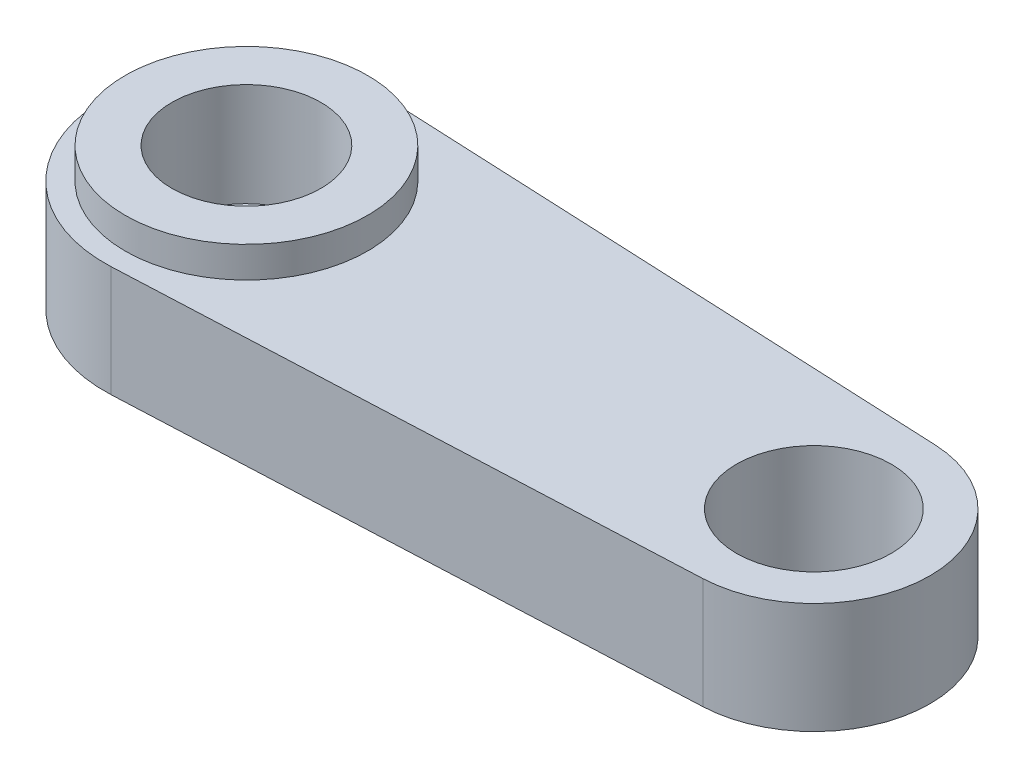
ISO-10303-21;
HEADER;
FILE_DESCRIPTION(('STEP AP214'),'2;1');
FILE_NAME('part.step','',(''),(''),'','','');
FILE_SCHEMA(('AUTOMOTIVE_DESIGN { 1 0 10303 214 1 1 1 1 }'));
ENDSEC;
DATA;
#1=APPLICATION_CONTEXT('core data for automotive mechanical design processes');
#2=APPLICATION_PROTOCOL_DEFINITION('international standard','automotive_design',2000,#1);
#3=PRODUCT_CONTEXT('',#1,'mechanical');
#4=PRODUCT('Part','Part','',(#3));
#5=PRODUCT_RELATED_PRODUCT_CATEGORY('part','',(#4));
#6=PRODUCT_DEFINITION_FORMATION('','',#4);
#7=PRODUCT_DEFINITION_CONTEXT('part definition',#1,'design');
#8=PRODUCT_DEFINITION('design','',#6,#7);
#9=PRODUCT_DEFINITION_SHAPE('','',#8);
#10=(LENGTH_UNIT() NAMED_UNIT(*) SI_UNIT(.MILLI.,.METRE.));
#11=(NAMED_UNIT(*) PLANE_ANGLE_UNIT() SI_UNIT($,.RADIAN.));
#12=(NAMED_UNIT(*) SI_UNIT($,.STERADIAN.) SOLID_ANGLE_UNIT());
#13=UNCERTAINTY_MEASURE_WITH_UNIT(LENGTH_MEASURE(1.E-05),#10,'distance_accuracy_value','');
#14=(GEOMETRIC_REPRESENTATION_CONTEXT(3) GLOBAL_UNCERTAINTY_ASSIGNED_CONTEXT((#13)) GLOBAL_UNIT_ASSIGNED_CONTEXT((#10,
#11,#12)) REPRESENTATION_CONTEXT('',''));
#15=CARTESIAN_POINT('',(0.,0.,0.));
#16=DIRECTION('',(0.,0.,1.));
#17=DIRECTION('',(1.,0.,0.));
#18=AXIS2_PLACEMENT_3D('',#15,#16,#17);
#19=CARTESIAN_POINT('',(0.,3.5,0.));
#20=DIRECTION('',(0.,-1.,0.));
#21=DIRECTION('',(0.,0.,-1.));
#22=AXIS2_PLACEMENT_3D('',#19,#20,#21);
#23=CYLINDRICAL_SURFACE('',#22,1.5);
#24=CARTESIAN_POINT('',(0.,2.5,0.));
#25=DIRECTION('',(0.,1.,0.));
#26=DIRECTION('',(0.,0.,1.));
#27=AXIS2_PLACEMENT_3D('',#24,#25,#26);
#28=CIRCLE('',#27,1.5);
#29=CARTESIAN_POINT('',(0.,2.5,1.5));
#30=VERTEX_POINT('',#29);
#31=EDGE_CURVE('E133',#30,#30,#28,.T.);
#32=ORIENTED_EDGE('',*,*,#31,.T.);
#33=EDGE_LOOP('',(#32));
#34=FACE_BOUND('',#33,.T.);
#35=CARTESIAN_POINT('',(0.,1.,0.));
#36=DIRECTION('',(0.,-1.,0.));
#37=DIRECTION('',(0.,0.,-1.));
#38=AXIS2_PLACEMENT_3D('',#35,#36,#37);
#39=CIRCLE('',#38,1.5);
#40=CARTESIAN_POINT('',(0.,1.,-1.5));
#41=VERTEX_POINT('',#40);
#42=EDGE_CURVE('E202',#41,#41,#39,.T.);
#43=ORIENTED_EDGE('',*,*,#42,.T.);
#44=EDGE_LOOP('',(#43));
#45=FACE_BOUND('',#44,.T.);
#46=ADVANCED_FACE('F71',(#34,#45),#23,.F.);
#47=CARTESIAN_POINT('',(22.,3.5,0.));
#48=DIRECTION('',(0.,-1.,0.));
#49=DIRECTION('',(0.,0.,-1.));
#50=AXIS2_PLACEMENT_3D('',#47,#48,#49);
#51=CYLINDRICAL_SURFACE('',#50,4.5);
#52=DIRECTION('',(0.,-1.,0.));
#53=VECTOR('',#52,1.);
#54=CARTESIAN_POINT('',(22.2045454545455,3.5,4.49534883596644));
#55=LINE('',#54,#53);
#56=CARTESIAN_POINT('',(22.2045454545455,5.3,4.49534883596644));
#57=VERTEX_POINT('',#56);
#58=CARTESIAN_POINT('',(22.2045454545455,1.,4.49534883596644));
#59=VERTEX_POINT('',#58);
#60=EDGE_CURVE('E128',#57,#59,#55,.T.);
#61=ORIENTED_EDGE('',*,*,#60,.T.);
#62=CARTESIAN_POINT('',(22.,1.,0.));
#63=DIRECTION('',(0.,-1.,0.));
#64=DIRECTION('',(0.,0.,-1.));
#65=AXIS2_PLACEMENT_3D('',#62,#63,#64);
#66=CIRCLE('',#65,4.5);
#67=CARTESIAN_POINT('',(22.2045454545455,1.,-4.49534883596644));
#68=VERTEX_POINT('',#67);
#69=EDGE_CURVE('E88',#68,#59,#66,.T.);
#70=ORIENTED_EDGE('',*,*,#69,.F.);
#71=DIRECTION('',(0.,-1.,0.));
#72=VECTOR('',#71,1.);
#73=CARTESIAN_POINT('',(22.2045454545455,3.5,-4.49534883596644));
#74=LINE('',#73,#72);
#75=CARTESIAN_POINT('',(22.2045454545455,5.3,-4.49534883596644));
#76=VERTEX_POINT('',#75);
#77=EDGE_CURVE('E12',#76,#68,#74,.T.);
#78=ORIENTED_EDGE('',*,*,#77,.F.);
#79=CARTESIAN_POINT('',(22.,5.3,0.));
#80=DIRECTION('',(0.,1.,0.));
#81=DIRECTION('',(0.,0.,1.));
#82=AXIS2_PLACEMENT_3D('',#79,#80,#81);
#83=CIRCLE('',#82,4.5);
#84=EDGE_CURVE('E208',#57,#76,#83,.T.);
#85=ORIENTED_EDGE('',*,*,#84,.F.);
#86=EDGE_LOOP('',(#61,#70,#78,#85));
#87=FACE_BOUND('',#86,.T.);
#88=ADVANCED_FACE('F73',(#87),#51,.T.);
#89=CARTESIAN_POINT('',(0.25,3.5,-5.49431524395898));
#90=DIRECTION('',(0.0454545454545455,0.,-0.998966407992542));
#91=DIRECTION('',(-0.998966407992542,0.,-0.0454545454545455));
#92=AXIS2_PLACEMENT_3D('',#89,#90,#91);
#93=PLANE('',#92);
#94=ORIENTED_EDGE('',*,*,#77,.T.);
#95=DIRECTION('',(0.998966407992541,0.,0.0454545454545454));
#96=VECTOR('',#95,1.);
#97=CARTESIAN_POINT('',(0.249999999999997,1.,-5.49431524395898));
#98=LINE('',#97,#96);
#99=CARTESIAN_POINT('',(0.249999999999997,1.,-5.49431524395898));
#100=VERTEX_POINT('',#99);
#101=EDGE_CURVE('E122',#100,#68,#98,.T.);
#102=ORIENTED_EDGE('',*,*,#101,.F.);
#103=DIRECTION('',(0.,-1.,0.));
#104=VECTOR('',#103,1.);
#105=CARTESIAN_POINT('',(0.249999999999999,3.5,-5.49431524395898));
#106=LINE('',#105,#104);
#107=CARTESIAN_POINT('',(0.249999999999999,5.3,-5.49431524395898));
#108=VERTEX_POINT('',#107);
#109=EDGE_CURVE('E80',#108,#100,#106,.T.);
#110=ORIENTED_EDGE('',*,*,#109,.F.);
#111=DIRECTION('',(-0.998966407992541,0.,-0.0454545454545455));
#112=VECTOR('',#111,1.);
#113=CARTESIAN_POINT('',(0.25,5.3,-5.49431524395898));
#114=LINE('',#113,#112);
#115=EDGE_CURVE('E211',#76,#108,#114,.T.);
#116=ORIENTED_EDGE('',*,*,#115,.F.);
#117=EDGE_LOOP('',(#94,#102,#110,#116));
#118=FACE_BOUND('',#117,.T.);
#119=ADVANCED_FACE('F180',(#118),#93,.T.);
#120=CARTESIAN_POINT('',(0.,3.5,0.));
#121=DIRECTION('',(0.,-1.,0.));
#122=DIRECTION('',(0.,0.,-1.));
#123=AXIS2_PLACEMENT_3D('',#120,#121,#122);
#124=CYLINDRICAL_SURFACE('',#123,5.5);
#125=CARTESIAN_POINT('',(0.,1.,0.));
#126=DIRECTION('',(0.,-1.,0.));
#127=DIRECTION('',(0.,0.,-1.));
#128=AXIS2_PLACEMENT_3D('',#125,#126,#127);
#129=CIRCLE('',#128,5.5);
#130=CARTESIAN_POINT('',(0.250000000000001,1.,5.49431524395898));
#131=VERTEX_POINT('',#130);
#132=EDGE_CURVE('E115',#131,#100,#129,.T.);
#133=ORIENTED_EDGE('',*,*,#132,.F.);
#134=DIRECTION('',(0.,-1.,0.));
#135=VECTOR('',#134,1.);
#136=CARTESIAN_POINT('',(0.25,3.5,5.49431524395898));
#137=LINE('',#136,#135);
#138=CARTESIAN_POINT('',(0.25,5.3,5.49431524395898));
#139=VERTEX_POINT('',#138);
#140=EDGE_CURVE('E96',#139,#131,#137,.T.);
#141=ORIENTED_EDGE('',*,*,#140,.F.);
#142=CARTESIAN_POINT('',(0.,5.3,0.));
#143=DIRECTION('',(0.,1.,0.));
#144=DIRECTION('',(0.,0.,1.));
#145=AXIS2_PLACEMENT_3D('',#142,#143,#144);
#146=CIRCLE('',#145,5.5);
#147=EDGE_CURVE('E214',#108,#139,#146,.T.);
#148=ORIENTED_EDGE('',*,*,#147,.F.);
#149=ORIENTED_EDGE('',*,*,#109,.T.);
#150=EDGE_LOOP('',(#133,#141,#148,#149));
#151=FACE_BOUND('',#150,.T.);
#152=ADVANCED_FACE('F121',(#151),#124,.T.);
#153=CARTESIAN_POINT('',(22.2045454545455,3.5,4.49534883596644));
#154=DIRECTION('',(0.0454545454545455,0.,0.998966407992542));
#155=DIRECTION('',(0.998966407992542,0.,-0.0454545454545455));
#156=AXIS2_PLACEMENT_3D('',#153,#154,#155);
#157=PLANE('',#156);
#158=ORIENTED_EDGE('',*,*,#140,.T.);
#159=DIRECTION('',(-0.998966407992541,0.,0.0454545454545454));
#160=VECTOR('',#159,1.);
#161=CARTESIAN_POINT('',(22.2045454545455,1.,4.49534883596644));
#162=LINE('',#161,#160);
#163=EDGE_CURVE('E113',#59,#131,#162,.T.);
#164=ORIENTED_EDGE('',*,*,#163,.F.);
#165=ORIENTED_EDGE('',*,*,#60,.F.);
#166=DIRECTION('',(0.998966407992541,0.,-0.0454545454545455));
#167=VECTOR('',#166,1.);
#168=CARTESIAN_POINT('',(0.25,5.3,5.49431524395898));
#169=LINE('',#168,#167);
#170=EDGE_CURVE('E127',#139,#57,#169,.T.);
#171=ORIENTED_EDGE('',*,*,#170,.F.);
#172=EDGE_LOOP('',(#158,#164,#165,#171));
#173=FACE_BOUND('',#172,.T.);
#174=ADVANCED_FACE('F125',(#173),#157,.T.);
#175=CARTESIAN_POINT('',(22.,3.5,0.));
#176=DIRECTION('',(0.,-1.,0.));
#177=DIRECTION('',(0.,0.,-1.));
#178=AXIS2_PLACEMENT_3D('',#175,#176,#177);
#179=CYLINDRICAL_SURFACE('',#178,2.99999999999999);
#180=CARTESIAN_POINT('',(22.,5.3,0.));
#181=DIRECTION('',(0.,1.,0.));
#182=DIRECTION('',(0.,0.,1.));
#183=AXIS2_PLACEMENT_3D('',#180,#181,#182);
#184=CIRCLE('',#183,2.99999999999999);
#185=CARTESIAN_POINT('',(22.,5.3,2.99999999999999));
#186=VERTEX_POINT('',#185);
#187=EDGE_CURVE('E147',#186,#186,#184,.F.);
#188=ORIENTED_EDGE('',*,*,#187,.F.);
#189=EDGE_LOOP('',(#188));
#190=FACE_BOUND('',#189,.T.);
#191=CARTESIAN_POINT('',(22.,1.,0.));
#192=DIRECTION('',(0.,-1.,0.));
#193=DIRECTION('',(0.,0.,-1.));
#194=AXIS2_PLACEMENT_3D('',#191,#192,#193);
#195=CIRCLE('',#194,2.99999999999999);
#196=CARTESIAN_POINT('',(22.,1.,-2.99999999999999));
#197=VERTEX_POINT('',#196);
#198=EDGE_CURVE('E75',#197,#197,#195,.T.);
#199=ORIENTED_EDGE('',*,*,#198,.T.);
#200=EDGE_LOOP('',(#199));
#201=FACE_BOUND('',#200,.T.);
#202=ADVANCED_FACE('F171',(#190,#201),#179,.F.);
#203=CARTESIAN_POINT('',(0.,6.5,0.));
#204=DIRECTION('',(0.,1.,0.));
#205=DIRECTION('',(0.,0.,1.));
#206=AXIS2_PLACEMENT_3D('',#203,#204,#205);
#207=PLANE('',#206);
#208=CARTESIAN_POINT('',(0.,6.5,0.));
#209=DIRECTION('',(0.,1.,0.));
#210=DIRECTION('',(0.,0.,1.));
#211=AXIS2_PLACEMENT_3D('',#208,#209,#210);
#212=CIRCLE('',#211,4.7);
#213=CARTESIAN_POINT('',(0.,6.5,4.7));
#214=VERTEX_POINT('',#213);
#215=EDGE_CURVE('E131',#214,#214,#212,.T.);
#216=ORIENTED_EDGE('',*,*,#215,.T.);
#217=EDGE_LOOP('',(#216));
#218=FACE_BOUND('',#217,.T.);
#219=CARTESIAN_POINT('',(0.,6.5,0.));
#220=DIRECTION('',(0.,1.,0.));
#221=DIRECTION('',(0.,0.,1.));
#222=AXIS2_PLACEMENT_3D('',#219,#220,#221);
#223=CIRCLE('',#222,2.89);
#224=CARTESIAN_POINT('',(0.,6.5,2.89));
#225=VERTEX_POINT('',#224);
#226=EDGE_CURVE('E135',#225,#225,#223,.T.);
#227=ORIENTED_EDGE('',*,*,#226,.F.);
#228=EDGE_LOOP('',(#227));
#229=FACE_BOUND('',#228,.T.);
#230=ADVANCED_FACE('F154',(#218,#229),#207,.T.);
#231=CARTESIAN_POINT('',(0.,6.5,0.));
#232=DIRECTION('',(0.,-1.,0.));
#233=DIRECTION('',(0.,0.,-1.));
#234=AXIS2_PLACEMENT_3D('',#231,#232,#233);
#235=CYLINDRICAL_SURFACE('',#234,4.7);
#236=CARTESIAN_POINT('',(0.,5.3,0.));
#237=DIRECTION('',(0.,1.,0.));
#238=DIRECTION('',(0.,0.,1.));
#239=AXIS2_PLACEMENT_3D('',#236,#237,#238);
#240=CIRCLE('',#239,4.7);
#241=CARTESIAN_POINT('',(0.,5.3,4.7));
#242=VERTEX_POINT('',#241);
#243=EDGE_CURVE('E142',#242,#242,#240,.F.);
#244=ORIENTED_EDGE('',*,*,#243,.F.);
#245=EDGE_LOOP('',(#244));
#246=FACE_BOUND('',#245,.T.);
#247=ORIENTED_EDGE('',*,*,#215,.F.);
#248=EDGE_LOOP('',(#247));
#249=FACE_BOUND('',#248,.T.);
#250=ADVANCED_FACE('F157',(#246,#249),#235,.T.);
#251=CARTESIAN_POINT('',(0.,6.5,0.));
#252=DIRECTION('',(0.,-1.,0.));
#253=DIRECTION('',(0.,0.,-1.));
#254=AXIS2_PLACEMENT_3D('',#251,#252,#253);
#255=CYLINDRICAL_SURFACE('',#254,2.89);
#256=ORIENTED_EDGE('',*,*,#226,.T.);
#257=EDGE_LOOP('',(#256));
#258=FACE_BOUND('',#257,.T.);
#259=CARTESIAN_POINT('',(0.,2.5,0.));
#260=DIRECTION('',(0.,1.,0.));
#261=DIRECTION('',(0.,0.,1.));
#262=AXIS2_PLACEMENT_3D('',#259,#260,#261);
#263=CIRCLE('',#262,2.89);
#264=CARTESIAN_POINT('',(0.,2.5,2.89));
#265=VERTEX_POINT('',#264);
#266=EDGE_CURVE('E136',#265,#265,#263,.T.);
#267=ORIENTED_EDGE('',*,*,#266,.F.);
#268=EDGE_LOOP('',(#267));
#269=FACE_BOUND('',#268,.T.);
#270=ADVANCED_FACE('F159',(#258,#269),#255,.F.);
#271=CARTESIAN_POINT('',(0.,2.5,0.));
#272=DIRECTION('',(0.,1.,0.));
#273=DIRECTION('',(0.,0.,1.));
#274=AXIS2_PLACEMENT_3D('',#271,#272,#273);
#275=PLANE('',#274);
#276=ORIENTED_EDGE('',*,*,#31,.F.);
#277=EDGE_LOOP('',(#276));
#278=FACE_BOUND('',#277,.T.);
#279=ORIENTED_EDGE('',*,*,#266,.T.);
#280=EDGE_LOOP('',(#279));
#281=FACE_BOUND('',#280,.T.);
#282=ADVANCED_FACE('F167',(#278,#281),#275,.T.);
#283=CARTESIAN_POINT('',(0.,5.3,0.));
#284=DIRECTION('',(0.,1.,0.));
#285=DIRECTION('',(0.,0.,1.));
#286=AXIS2_PLACEMENT_3D('',#283,#284,#285);
#287=PLANE('',#286);
#288=ORIENTED_EDGE('',*,*,#170,.T.);
#289=ORIENTED_EDGE('',*,*,#84,.T.);
#290=ORIENTED_EDGE('',*,*,#115,.T.);
#291=ORIENTED_EDGE('',*,*,#147,.T.);
#292=EDGE_LOOP('',(#288,#289,#290,#291));
#293=FACE_BOUND('',#292,.T.);
#294=ORIENTED_EDGE('',*,*,#187,.T.);
#295=EDGE_LOOP('',(#294));
#296=FACE_BOUND('',#295,.T.);
#297=ORIENTED_EDGE('',*,*,#243,.T.);
#298=EDGE_LOOP('',(#297));
#299=FACE_BOUND('',#298,.T.);
#300=ADVANCED_FACE('F216',(#293,#296,#299),#287,.T.);
#301=CARTESIAN_POINT('',(22.,1.,0.));
#302=DIRECTION('',(0.,-1.,0.));
#303=DIRECTION('',(0.,0.,-1.));
#304=AXIS2_PLACEMENT_3D('',#301,#302,#303);
#305=PLANE('',#304);
#306=ORIENTED_EDGE('',*,*,#42,.F.);
#307=EDGE_LOOP('',(#306));
#308=FACE_BOUND('',#307,.T.);
#309=ORIENTED_EDGE('',*,*,#198,.F.);
#310=EDGE_LOOP('',(#309));
#311=FACE_BOUND('',#310,.T.);
#312=ORIENTED_EDGE('',*,*,#69,.T.);
#313=ORIENTED_EDGE('',*,*,#163,.T.);
#314=ORIENTED_EDGE('',*,*,#132,.T.);
#315=ORIENTED_EDGE('',*,*,#101,.T.);
#316=EDGE_LOOP('',(#312,#313,#314,#315));
#317=FACE_BOUND('',#316,.T.);
#318=ADVANCED_FACE('F114',(#308,#311,#317),#305,.T.);
#319=CLOSED_SHELL('',(#46,#88,#119,#152,#174,#202,#230,#250,#270,#282,#300,#318));
#320=MANIFOLD_SOLID_BREP('B2',#319);
#321=ADVANCED_BREP_SHAPE_REPRESENTATION('',(#18,#320),#14);
#322=SHAPE_DEFINITION_REPRESENTATION(#9,#321);
ENDSEC;
END-ISO-10303-21;
